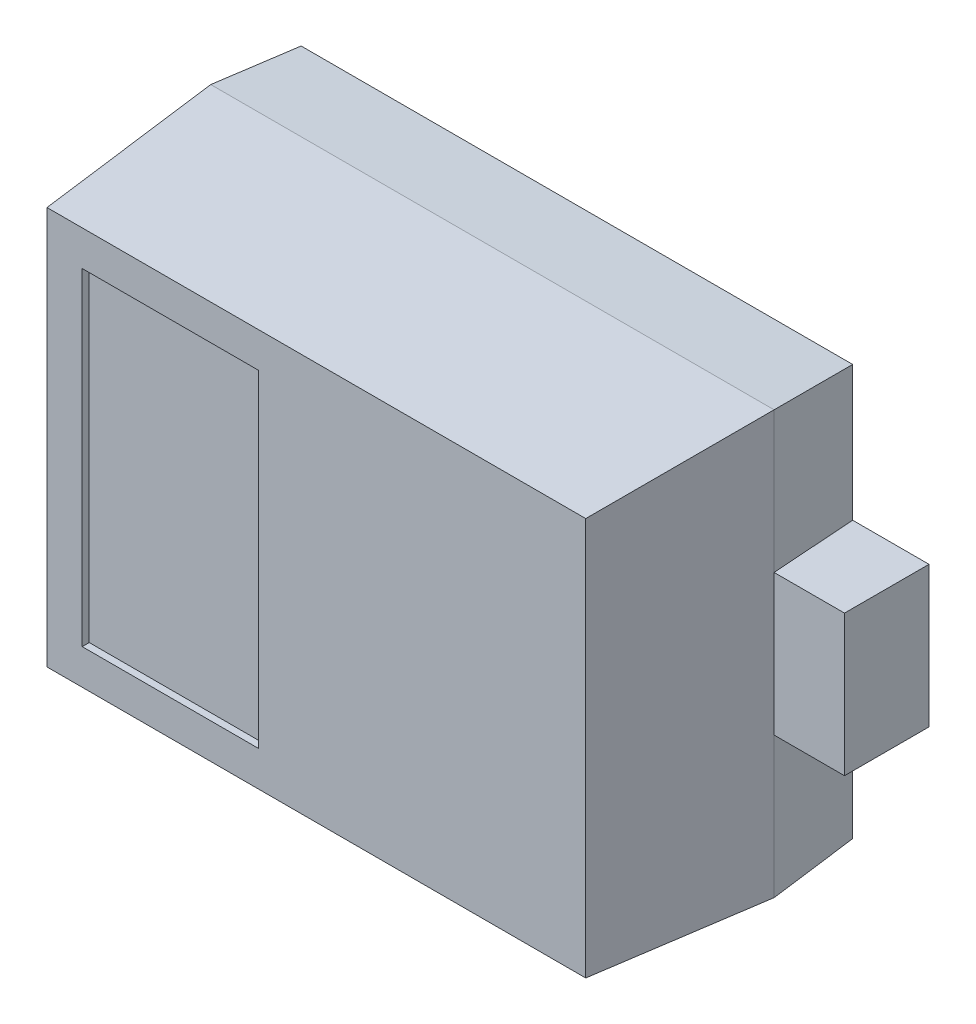
ISO-10303-21;
HEADER;
FILE_DESCRIPTION(('STEP AP214'),'2;1');
FILE_NAME('part.step','',(''),(''),'','','');
FILE_SCHEMA(('AUTOMOTIVE_DESIGN { 1 0 10303 214 1 1 1 1 }'));
ENDSEC;
DATA;
#1=APPLICATION_CONTEXT('core data for automotive mechanical design processes');
#2=APPLICATION_PROTOCOL_DEFINITION('international standard','automotive_design',2000,#1);
#3=PRODUCT_CONTEXT('',#1,'mechanical');
#4=PRODUCT('Part','Part','',(#3));
#5=PRODUCT_RELATED_PRODUCT_CATEGORY('part','',(#4));
#6=PRODUCT_DEFINITION_FORMATION('','',#4);
#7=PRODUCT_DEFINITION_CONTEXT('part definition',#1,'design');
#8=PRODUCT_DEFINITION('design','',#6,#7);
#9=PRODUCT_DEFINITION_SHAPE('','',#8);
#10=(LENGTH_UNIT() NAMED_UNIT(*) SI_UNIT(.MILLI.,.METRE.));
#11=(NAMED_UNIT(*) PLANE_ANGLE_UNIT() SI_UNIT($,.RADIAN.));
#12=(NAMED_UNIT(*) SI_UNIT($,.STERADIAN.) SOLID_ANGLE_UNIT());
#13=UNCERTAINTY_MEASURE_WITH_UNIT(LENGTH_MEASURE(1.E-05),#10,'distance_accuracy_value','');
#14=(GEOMETRIC_REPRESENTATION_CONTEXT(3) GLOBAL_UNCERTAINTY_ASSIGNED_CONTEXT((#13)) GLOBAL_UNIT_ASSIGNED_CONTEXT((#10,
#11,#12)) REPRESENTATION_CONTEXT('',''));
#15=CARTESIAN_POINT('',(0.,0.,0.));
#16=DIRECTION('',(0.,0.,1.));
#17=DIRECTION('',(1.,0.,0.));
#18=AXIS2_PLACEMENT_3D('',#15,#16,#17);
#19=CARTESIAN_POINT('',(-0.332518297014,-0.232518297014,0.36));
#20=DIRECTION('',(0.,0.,1.));
#21=DIRECTION('',(1.,0.,0.));
#22=AXIS2_PLACEMENT_3D('',#19,#20,#21);
#23=PLANE('',#22);
#24=DIRECTION('',(0.,1.,0.));
#25=VECTOR('',#24,1.);
#26=CARTESIAN_POINT('',(-0.08251829701412,-0.232518297014,0.36));
#27=LINE('',#26,#25);
#28=CARTESIAN_POINT('',(-0.08251829701412,-0.232518297014,0.36));
#29=VERTEX_POINT('',#28);
#30=CARTESIAN_POINT('',(-0.08251829701412,0.232518297014,0.36));
#31=VERTEX_POINT('',#30);
#32=EDGE_CURVE('E226',#29,#31,#27,.T.);
#33=ORIENTED_EDGE('',*,*,#32,.T.);
#34=DIRECTION('',(1.,0.,0.));
#35=VECTOR('',#34,1.);
#36=CARTESIAN_POINT('',(-0.332518297014,0.232518297014,0.36));
#37=LINE('',#36,#35);
#38=CARTESIAN_POINT('',(-0.332518297014,0.232518297014,0.36));
#39=VERTEX_POINT('',#38);
#40=EDGE_CURVE('E243',#31,#39,#37,.F.);
#41=ORIENTED_EDGE('',*,*,#40,.T.);
#42=DIRECTION('',(0.,1.,0.));
#43=VECTOR('',#42,1.);
#44=CARTESIAN_POINT('',(-0.332518297014,-0.232518297014,0.36));
#45=LINE('',#44,#43);
#46=CARTESIAN_POINT('',(-0.332518297014,-0.232518297014,0.36));
#47=VERTEX_POINT('',#46);
#48=EDGE_CURVE('E240',#47,#39,#45,.T.);
#49=ORIENTED_EDGE('',*,*,#48,.F.);
#50=DIRECTION('',(1.,0.,0.));
#51=VECTOR('',#50,1.);
#52=CARTESIAN_POINT('',(-0.332518297014,-0.232518297014,0.36));
#53=LINE('',#52,#51);
#54=EDGE_CURVE('E234',#29,#47,#53,.F.);
#55=ORIENTED_EDGE('',*,*,#54,.F.);
#56=EDGE_LOOP('',(#33,#41,#49,#55));
#57=FACE_BOUND('',#56,.T.);
#58=ADVANCED_FACE('F17',(#57),#23,.T.);
#59=CARTESIAN_POINT('',(-0.332518297014,0.232518297014,0.36));
#60=DIRECTION('',(0.,1.,0.));
#61=DIRECTION('',(0.,0.,1.));
#62=AXIS2_PLACEMENT_3D('',#59,#60,#61);
#63=PLANE('',#62);
#64=DIRECTION('',(0.,0.,-1.));
#65=VECTOR('',#64,1.);
#66=CARTESIAN_POINT('',(-0.332518297014,0.232518297014,0.36));
#67=LINE('',#66,#65);
#68=CARTESIAN_POINT('',(-0.332518297014,0.232518297014,0.37));
#69=VERTEX_POINT('',#68);
#70=EDGE_CURVE('E237',#39,#69,#67,.F.);
#71=ORIENTED_EDGE('',*,*,#70,.F.);
#72=ORIENTED_EDGE('',*,*,#40,.F.);
#73=DIRECTION('',(0.,0.,-1.));
#74=VECTOR('',#73,1.);
#75=CARTESIAN_POINT('',(-0.08251829701412,0.232518297014,0.36));
#76=LINE('',#75,#74);
#77=CARTESIAN_POINT('',(-0.08251829701412,0.232518297014,0.37));
#78=VERTEX_POINT('',#77);
#79=EDGE_CURVE('E204',#31,#78,#76,.F.);
#80=ORIENTED_EDGE('',*,*,#79,.T.);
#81=DIRECTION('',(-1.,0.,0.));
#82=VECTOR('',#81,1.);
#83=CARTESIAN_POINT('',(-0.382518297014,0.232518297014,0.37));
#84=LINE('',#83,#82);
#85=EDGE_CURVE('E202',#78,#69,#84,.T.);
#86=ORIENTED_EDGE('',*,*,#85,.T.);
#87=EDGE_LOOP('',(#71,#72,#80,#86));
#88=FACE_BOUND('',#87,.T.);
#89=ADVANCED_FACE('F424',(#88),#63,.F.);
#90=CARTESIAN_POINT('',(-0.332518297014,-0.232518297014,0.36));
#91=DIRECTION('',(1.,0.,0.));
#92=DIRECTION('',(0.,0.,-1.));
#93=AXIS2_PLACEMENT_3D('',#90,#91,#92);
#94=PLANE('',#93);
#95=ORIENTED_EDGE('',*,*,#70,.T.);
#96=DIRECTION('',(0.,1.,0.));
#97=VECTOR('',#96,1.);
#98=CARTESIAN_POINT('',(-0.332518297014,-0.282518297014,0.37));
#99=LINE('',#98,#97);
#100=CARTESIAN_POINT('',(-0.332518297014,-0.232518297014,0.37));
#101=VERTEX_POINT('',#100);
#102=EDGE_CURVE('E200',#69,#101,#99,.F.);
#103=ORIENTED_EDGE('',*,*,#102,.T.);
#104=DIRECTION('',(0.,0.,1.));
#105=VECTOR('',#104,1.);
#106=CARTESIAN_POINT('',(-0.332518297014,-0.232518297014,0.36));
#107=LINE('',#106,#105);
#108=EDGE_CURVE('E231',#47,#101,#107,.T.);
#109=ORIENTED_EDGE('',*,*,#108,.F.);
#110=ORIENTED_EDGE('',*,*,#48,.T.);
#111=EDGE_LOOP('',(#95,#103,#109,#110));
#112=FACE_BOUND('',#111,.T.);
#113=ADVANCED_FACE('F420',(#112),#94,.T.);
#114=CARTESIAN_POINT('',(-0.332518297014,-0.232518297014,0.36));
#115=DIRECTION('',(0.,1.,0.));
#116=DIRECTION('',(0.,0.,1.));
#117=AXIS2_PLACEMENT_3D('',#114,#115,#116);
#118=PLANE('',#117);
#119=ORIENTED_EDGE('',*,*,#108,.T.);
#120=DIRECTION('',(-1.,0.,0.));
#121=VECTOR('',#120,1.);
#122=CARTESIAN_POINT('',(-0.382518297014,-0.232518297014,0.37));
#123=LINE('',#122,#121);
#124=CARTESIAN_POINT('',(-0.08251829701412,-0.232518297014,0.37));
#125=VERTEX_POINT('',#124);
#126=EDGE_CURVE('E198',#101,#125,#123,.F.);
#127=ORIENTED_EDGE('',*,*,#126,.T.);
#128=DIRECTION('',(0.,0.,-1.));
#129=VECTOR('',#128,1.);
#130=CARTESIAN_POINT('',(-0.08251829701412,-0.232518297014,0.36));
#131=LINE('',#130,#129);
#132=EDGE_CURVE('E228',#125,#29,#131,.T.);
#133=ORIENTED_EDGE('',*,*,#132,.T.);
#134=ORIENTED_EDGE('',*,*,#54,.T.);
#135=EDGE_LOOP('',(#119,#127,#133,#134));
#136=FACE_BOUND('',#135,.T.);
#137=ADVANCED_FACE('F416',(#136),#118,.T.);
#138=CARTESIAN_POINT('',(-0.08251829701412,-0.232518297014,0.36));
#139=DIRECTION('',(1.,0.,0.));
#140=DIRECTION('',(0.,0.,-1.));
#141=AXIS2_PLACEMENT_3D('',#138,#139,#140);
#142=PLANE('',#141);
#143=ORIENTED_EDGE('',*,*,#79,.F.);
#144=ORIENTED_EDGE('',*,*,#32,.F.);
#145=ORIENTED_EDGE('',*,*,#132,.F.);
#146=DIRECTION('',(0.,1.,0.));
#147=VECTOR('',#146,1.);
#148=CARTESIAN_POINT('',(-0.08251829701412,-0.282518297014,0.37));
#149=LINE('',#148,#147);
#150=EDGE_CURVE('E195',#125,#78,#149,.T.);
#151=ORIENTED_EDGE('',*,*,#150,.T.);
#152=EDGE_LOOP('',(#143,#144,#145,#151));
#153=FACE_BOUND('',#152,.T.);
#154=ADVANCED_FACE('F413',(#153),#142,.F.);
#155=CARTESIAN_POINT('',(-0.391608782567,0.1,0.12));
#156=DIRECTION('',(0.,0.,1.));
#157=DIRECTION('',(1.,0.,0.));
#158=AXIS2_PLACEMENT_3D('',#155,#156,#157);
#159=PLANE('',#158);
#160=DIRECTION('',(0.,-1.,0.));
#161=VECTOR('',#160,1.);
#162=CARTESIAN_POINT('',(-0.5,0.1,0.12));
#163=LINE('',#162,#161);
#164=CARTESIAN_POINT('',(-0.5,-0.1,0.12));
#165=VERTEX_POINT('',#164);
#166=CARTESIAN_POINT('',(-0.5,0.1,0.12));
#167=VERTEX_POINT('',#166);
#168=EDGE_CURVE('E147',#165,#167,#163,.F.);
#169=ORIENTED_EDGE('',*,*,#168,.F.);
#170=DIRECTION('',(1.,0.,0.));
#171=VECTOR('',#170,1.);
#172=CARTESIAN_POINT('',(-0.391608782567,-0.1,0.12));
#173=LINE('',#172,#171);
#174=CARTESIAN_POINT('',(-0.4,-0.0999999999999878,0.12));
#175=VERTEX_POINT('',#174);
#176=EDGE_CURVE('E140',#175,#165,#173,.F.);
#177=ORIENTED_EDGE('',*,*,#176,.F.);
#178=DIRECTION('',(0.,-1.,0.));
#179=VECTOR('',#178,1.);
#180=CARTESIAN_POINT('',(-0.4,0.,0.12));
#181=LINE('',#180,#179);
#182=CARTESIAN_POINT('',(-0.4,0.0999999999999936,0.12));
#183=VERTEX_POINT('',#182);
#184=EDGE_CURVE('E144',#183,#175,#181,.T.);
#185=ORIENTED_EDGE('',*,*,#184,.F.);
#186=DIRECTION('',(1.,0.,0.));
#187=VECTOR('',#186,1.);
#188=CARTESIAN_POINT('',(-0.391608782567,0.1,0.12));
#189=LINE('',#188,#187);
#190=EDGE_CURVE('E222',#183,#167,#189,.F.);
#191=ORIENTED_EDGE('',*,*,#190,.T.);
#192=EDGE_LOOP('',(#169,#177,#185,#191));
#193=FACE_BOUND('',#192,.T.);
#194=ADVANCED_FACE('F142',(#193),#159,.T.);
#195=CARTESIAN_POINT('',(0.391608782567,-0.1,0.12));
#196=DIRECTION('',(0.,0.,1.));
#197=DIRECTION('',(1.,0.,0.));
#198=AXIS2_PLACEMENT_3D('',#195,#196,#197);
#199=PLANE('',#198);
#200=DIRECTION('',(0.,1.,0.));
#201=VECTOR('',#200,1.);
#202=CARTESIAN_POINT('',(0.5,-0.1,0.12));
#203=LINE('',#202,#201);
#204=CARTESIAN_POINT('',(0.5,0.1,0.12));
#205=VERTEX_POINT('',#204);
#206=CARTESIAN_POINT('',(0.5,-0.1,0.12));
#207=VERTEX_POINT('',#206);
#208=EDGE_CURVE('E205',#205,#207,#203,.F.);
#209=ORIENTED_EDGE('',*,*,#208,.F.);
#210=DIRECTION('',(-1.,0.,0.));
#211=VECTOR('',#210,1.);
#212=CARTESIAN_POINT('',(0.391608782567,0.1,0.12));
#213=LINE('',#212,#211);
#214=CARTESIAN_POINT('',(0.4,0.0999999999999878,0.12));
#215=VERTEX_POINT('',#214);
#216=EDGE_CURVE('E208',#215,#205,#213,.F.);
#217=ORIENTED_EDGE('',*,*,#216,.F.);
#218=DIRECTION('',(0.,1.,0.));
#219=VECTOR('',#218,1.);
#220=CARTESIAN_POINT('',(0.4,0.,0.12));
#221=LINE('',#220,#219);
#222=CARTESIAN_POINT('',(0.4,-0.0999999999999936,0.12));
#223=VERTEX_POINT('',#222);
#224=EDGE_CURVE('E303',#223,#215,#221,.T.);
#225=ORIENTED_EDGE('',*,*,#224,.F.);
#226=DIRECTION('',(-1.,0.,0.));
#227=VECTOR('',#226,1.);
#228=CARTESIAN_POINT('',(0.391608782567,-0.1,0.12));
#229=LINE('',#228,#227);
#230=EDGE_CURVE('E215',#223,#207,#229,.F.);
#231=ORIENTED_EDGE('',*,*,#230,.T.);
#232=EDGE_LOOP('',(#209,#217,#225,#231));
#233=FACE_BOUND('',#232,.T.);
#234=ADVANCED_FACE('F366',(#233),#199,.T.);
#235=CARTESIAN_POINT('',(-0.382518297014,-0.282518297014,0.37));
#236=DIRECTION('',(0.,0.,-1.));
#237=DIRECTION('',(-1.,0.,0.));
#238=AXIS2_PLACEMENT_3D('',#235,#236,#237);
#239=PLANE('',#238);
#240=ORIENTED_EDGE('',*,*,#126,.F.);
#241=ORIENTED_EDGE('',*,*,#102,.F.);
#242=ORIENTED_EDGE('',*,*,#85,.F.);
#243=ORIENTED_EDGE('',*,*,#150,.F.);
#244=EDGE_LOOP('',(#240,#241,#242,#243));
#245=FACE_BOUND('',#244,.T.);
#246=DIRECTION('',(1.,0.,0.));
#247=VECTOR('',#246,1.);
#248=CARTESIAN_POINT('',(0.,0.282518297014,0.37));
#249=LINE('',#248,#247);
#250=CARTESIAN_POINT('',(-0.382518297014,0.282518297014,0.37));
#251=VERTEX_POINT('',#250);
#252=CARTESIAN_POINT('',(0.382518297014,0.282518297014,0.37));
#253=VERTEX_POINT('',#252);
#254=EDGE_CURVE('E209',#251,#253,#249,.T.);
#255=ORIENTED_EDGE('',*,*,#254,.F.);
#256=DIRECTION('',(0.,1.,0.));
#257=VECTOR('',#256,1.);
#258=CARTESIAN_POINT('',(-0.382518297014,0.,0.37));
#259=LINE('',#258,#257);
#260=CARTESIAN_POINT('',(-0.382518297014,-0.282518297014,0.37));
#261=VERTEX_POINT('',#260);
#262=EDGE_CURVE('E171',#261,#251,#259,.T.);
#263=ORIENTED_EDGE('',*,*,#262,.F.);
#264=DIRECTION('',(-1.,0.,0.));
#265=VECTOR('',#264,1.);
#266=CARTESIAN_POINT('',(0.,-0.282518297014,0.37));
#267=LINE('',#266,#265);
#268=CARTESIAN_POINT('',(0.382518297014,-0.282518297014,0.37));
#269=VERTEX_POINT('',#268);
#270=EDGE_CURVE('E292',#269,#261,#267,.T.);
#271=ORIENTED_EDGE('',*,*,#270,.F.);
#272=DIRECTION('',(0.,-1.,0.));
#273=VECTOR('',#272,1.);
#274=CARTESIAN_POINT('',(0.382518297014,0.,0.37));
#275=LINE('',#274,#273);
#276=EDGE_CURVE('E298',#253,#269,#275,.T.);
#277=ORIENTED_EDGE('',*,*,#276,.F.);
#278=EDGE_LOOP('',(#255,#263,#271,#277));
#279=FACE_BOUND('',#278,.T.);
#280=ADVANCED_FACE('F343',(#245,#279),#239,.F.);
#281=CARTESIAN_POINT('',(-0.5,0.1,0.));
#282=DIRECTION('',(-1.,0.,0.));
#283=DIRECTION('',(0.,-1.,0.));
#284=AXIS2_PLACEMENT_3D('',#281,#282,#283);
#285=PLANE('',#284);
#286=DIRECTION('',(0.,0.,1.));
#287=VECTOR('',#286,1.);
#288=CARTESIAN_POINT('',(-0.5,-0.1,0.));
#289=LINE('',#288,#287);
#290=CARTESIAN_POINT('',(-0.5,-0.1,0.));
#291=VERTEX_POINT('',#290);
#292=EDGE_CURVE('E151',#165,#291,#289,.F.);
#293=ORIENTED_EDGE('',*,*,#292,.F.);
#294=ORIENTED_EDGE('',*,*,#168,.T.);
#295=DIRECTION('',(0.,0.,1.));
#296=VECTOR('',#295,1.);
#297=CARTESIAN_POINT('',(-0.5,0.1,0.));
#298=LINE('',#297,#296);
#299=CARTESIAN_POINT('',(-0.5,0.1,0.));
#300=VERTEX_POINT('',#299);
#301=EDGE_CURVE('E172',#167,#300,#298,.F.);
#302=ORIENTED_EDGE('',*,*,#301,.T.);
#303=DIRECTION('',(0.,1.,0.));
#304=VECTOR('',#303,1.);
#305=CARTESIAN_POINT('',(-0.5,0.1,0.));
#306=LINE('',#305,#304);
#307=EDGE_CURVE('E182',#300,#291,#306,.F.);
#308=ORIENTED_EDGE('',*,*,#307,.T.);
#309=EDGE_LOOP('',(#293,#294,#302,#308));
#310=FACE_BOUND('',#309,.T.);
#311=ADVANCED_FACE('F271',(#310),#285,.T.);
#312=CARTESIAN_POINT('',(-0.391608782567,-0.1,0.));
#313=DIRECTION('',(0.,-1.,0.));
#314=DIRECTION('',(1.,0.,0.));
#315=AXIS2_PLACEMENT_3D('',#312,#313,#314);
#316=PLANE('',#315);
#317=ORIENTED_EDGE('',*,*,#176,.T.);
#318=ORIENTED_EDGE('',*,*,#292,.T.);
#319=DIRECTION('',(1.,0.,0.));
#320=VECTOR('',#319,1.);
#321=CARTESIAN_POINT('',(-0.391608782567,-0.1,0.));
#322=LINE('',#321,#320);
#323=CARTESIAN_POINT('',(-0.391608782567,-0.0999999999999997,0.));
#324=VERTEX_POINT('',#323);
#325=EDGE_CURVE('E157',#291,#324,#322,.T.);
#326=ORIENTED_EDGE('',*,*,#325,.T.);
#327=DIRECTION('',(-0.069756473742295,0.,0.997564050259952));
#328=VECTOR('',#327,1.);
#329=CARTESIAN_POINT('',(-0.391608782567,-0.1,0.));
#330=LINE('',#329,#328);
#331=EDGE_CURVE('E21',#175,#324,#330,.F.);
#332=ORIENTED_EDGE('',*,*,#331,.F.);
#333=EDGE_LOOP('',(#317,#318,#326,#332));
#334=FACE_BOUND('',#333,.T.);
#335=ADVANCED_FACE('F155',(#334),#316,.T.);
#336=CARTESIAN_POINT('',(-0.391608782567,0.1,0.));
#337=DIRECTION('',(0.,-1.,0.));
#338=DIRECTION('',(1.,0.,0.));
#339=AXIS2_PLACEMENT_3D('',#336,#337,#338);
#340=PLANE('',#339);
#341=ORIENTED_EDGE('',*,*,#190,.F.);
#342=DIRECTION('',(-0.069756473742295,0.,0.997564050259952));
#343=VECTOR('',#342,1.);
#344=CARTESIAN_POINT('',(-0.391608782567,0.1,0.));
#345=LINE('',#344,#343);
#346=CARTESIAN_POINT('',(-0.391608782567,0.0999999999999998,0.));
#347=VERTEX_POINT('',#346);
#348=EDGE_CURVE('E189',#347,#183,#345,.T.);
#349=ORIENTED_EDGE('',*,*,#348,.F.);
#350=DIRECTION('',(1.,0.,0.));
#351=VECTOR('',#350,1.);
#352=CARTESIAN_POINT('',(-0.391608782567,0.1,0.));
#353=LINE('',#352,#351);
#354=EDGE_CURVE('E179',#347,#300,#353,.F.);
#355=ORIENTED_EDGE('',*,*,#354,.T.);
#356=ORIENTED_EDGE('',*,*,#301,.F.);
#357=EDGE_LOOP('',(#341,#349,#355,#356));
#358=FACE_BOUND('',#357,.T.);
#359=ADVANCED_FACE('F398',(#358),#340,.F.);
#360=CARTESIAN_POINT('',(-0.4,0.3,0.12));
#361=DIRECTION('',(-0.99756405025979,0.,0.0697564737446115));
#362=DIRECTION('',(0.,-1.,0.));
#363=AXIS2_PLACEMENT_3D('',#360,#361,#362);
#364=PLANE('',#363);
#365=ORIENTED_EDGE('',*,*,#262,.T.);
#366=DIRECTION('',(0.0695873743171474,-0.0695873743171471,0.995145815783441));
#367=VECTOR('',#366,1.);
#368=CARTESIAN_POINT('',(-0.391259148507,0.291259148507,0.245));
#369=LINE('',#368,#367);
#370=CARTESIAN_POINT('',(-0.4,0.3,0.12));
#371=VERTEX_POINT('',#370);
#372=EDGE_CURVE('E335',#371,#251,#369,.T.);
#373=ORIENTED_EDGE('',*,*,#372,.F.);
#374=DIRECTION('',(0.,1.,0.));
#375=VECTOR('',#374,1.);
#376=CARTESIAN_POINT('',(-0.4,0.,0.12));
#377=LINE('',#376,#375);
#378=EDGE_CURVE('E169',#183,#371,#377,.T.);
#379=ORIENTED_EDGE('',*,*,#378,.F.);
#380=ORIENTED_EDGE('',*,*,#184,.T.);
#381=DIRECTION('',(0.,1.,0.));
#382=VECTOR('',#381,1.);
#383=CARTESIAN_POINT('',(-0.4,0.,0.12));
#384=LINE('',#383,#382);
#385=CARTESIAN_POINT('',(-0.4,-0.3,0.12));
#386=VERTEX_POINT('',#385);
#387=EDGE_CURVE('E161',#386,#175,#384,.T.);
#388=ORIENTED_EDGE('',*,*,#387,.F.);
#389=DIRECTION('',(-0.0695873743171474,-0.0695873743171471,-0.995145815783441));
#390=VECTOR('',#389,1.);
#391=CARTESIAN_POINT('',(-0.391259148507,-0.291259148507,0.245));
#392=LINE('',#391,#390);
#393=EDGE_CURVE('E162',#261,#386,#392,.T.);
#394=ORIENTED_EDGE('',*,*,#393,.F.);
#395=EDGE_LOOP('',(#365,#373,#379,#380,#388,#394));
#396=FACE_BOUND('',#395,.T.);
#397=ADVANCED_FACE('F165',(#396),#364,.T.);
#398=CARTESIAN_POINT('',(0.4,0.3,0.12));
#399=DIRECTION('',(0.,0.99756405025979,0.0697564737446113));
#400=DIRECTION('',(-1.,0.,0.));
#401=AXIS2_PLACEMENT_3D('',#398,#399,#400);
#402=PLANE('',#401);
#403=ORIENTED_EDGE('',*,*,#254,.T.);
#404=DIRECTION('',(-0.0695873743171474,-0.0695873743171471,0.995145815783441));
#405=VECTOR('',#404,1.);
#406=CARTESIAN_POINT('',(0.391259148507,0.291259148507,0.245));
#407=LINE('',#406,#405);
#408=CARTESIAN_POINT('',(0.4,0.3,0.12));
#409=VERTEX_POINT('',#408);
#410=EDGE_CURVE('E300',#409,#253,#407,.T.);
#411=ORIENTED_EDGE('',*,*,#410,.F.);
#412=DIRECTION('',(1.,0.,0.));
#413=VECTOR('',#412,1.);
#414=CARTESIAN_POINT('',(0.,0.3,0.12));
#415=LINE('',#414,#413);
#416=EDGE_CURVE('E253',#371,#409,#415,.T.);
#417=ORIENTED_EDGE('',*,*,#416,.F.);
#418=ORIENTED_EDGE('',*,*,#372,.T.);
#419=EDGE_LOOP('',(#403,#411,#417,#418));
#420=FACE_BOUND('',#419,.T.);
#421=ADVANCED_FACE('F345',(#420),#402,.T.);
#422=CARTESIAN_POINT('',(0.5,-0.1,0.));
#423=DIRECTION('',(1.,0.,0.));
#424=DIRECTION('',(0.,1.,0.));
#425=AXIS2_PLACEMENT_3D('',#422,#423,#424);
#426=PLANE('',#425);
#427=DIRECTION('',(0.,0.,1.));
#428=VECTOR('',#427,1.);
#429=CARTESIAN_POINT('',(0.5,0.1,0.));
#430=LINE('',#429,#428);
#431=CARTESIAN_POINT('',(0.5,0.1,0.));
#432=VERTEX_POINT('',#431);
#433=EDGE_CURVE('E212',#205,#432,#430,.F.);
#434=ORIENTED_EDGE('',*,*,#433,.F.);
#435=ORIENTED_EDGE('',*,*,#208,.T.);
#436=DIRECTION('',(0.,0.,1.));
#437=VECTOR('',#436,1.);
#438=CARTESIAN_POINT('',(0.5,-0.1,0.));
#439=LINE('',#438,#437);
#440=CARTESIAN_POINT('',(0.5,-0.1,0.));
#441=VERTEX_POINT('',#440);
#442=EDGE_CURVE('E315',#207,#441,#439,.F.);
#443=ORIENTED_EDGE('',*,*,#442,.T.);
#444=DIRECTION('',(0.,1.,0.));
#445=VECTOR('',#444,1.);
#446=CARTESIAN_POINT('',(0.5,-0.1,0.));
#447=LINE('',#446,#445);
#448=EDGE_CURVE('E307',#441,#432,#447,.T.);
#449=ORIENTED_EDGE('',*,*,#448,.T.);
#450=EDGE_LOOP('',(#434,#435,#443,#449));
#451=FACE_BOUND('',#450,.T.);
#452=ADVANCED_FACE('F373',(#451),#426,.T.);
#453=CARTESIAN_POINT('',(0.391608782567,0.1,0.));
#454=DIRECTION('',(0.,1.,0.));
#455=DIRECTION('',(-1.,0.,0.));
#456=AXIS2_PLACEMENT_3D('',#453,#454,#455);
#457=PLANE('',#456);
#458=ORIENTED_EDGE('',*,*,#216,.T.);
#459=ORIENTED_EDGE('',*,*,#433,.T.);
#460=DIRECTION('',(1.,0.,0.));
#461=VECTOR('',#460,1.);
#462=CARTESIAN_POINT('',(0.391608782567,0.1,0.));
#463=LINE('',#462,#461);
#464=CARTESIAN_POINT('',(0.391608782567,0.0999999999999997,0.));
#465=VERTEX_POINT('',#464);
#466=EDGE_CURVE('E249',#432,#465,#463,.F.);
#467=ORIENTED_EDGE('',*,*,#466,.T.);
#468=DIRECTION('',(0.069756473742295,0.,0.997564050259952));
#469=VECTOR('',#468,1.);
#470=CARTESIAN_POINT('',(0.391608782567,0.1,0.));
#471=LINE('',#470,#469);
#472=EDGE_CURVE('E250',#215,#465,#471,.F.);
#473=ORIENTED_EDGE('',*,*,#472,.F.);
#474=EDGE_LOOP('',(#458,#459,#467,#473));
#475=FACE_BOUND('',#474,.T.);
#476=ADVANCED_FACE('F360',(#475),#457,.T.);
#477=CARTESIAN_POINT('',(0.391608782567,-0.1,0.));
#478=DIRECTION('',(0.,1.,0.));
#479=DIRECTION('',(-1.,0.,0.));
#480=AXIS2_PLACEMENT_3D('',#477,#478,#479);
#481=PLANE('',#480);
#482=ORIENTED_EDGE('',*,*,#230,.F.);
#483=DIRECTION('',(0.069756473742295,0.,0.997564050259952));
#484=VECTOR('',#483,1.);
#485=CARTESIAN_POINT('',(0.391608782567,-0.1,0.));
#486=LINE('',#485,#484);
#487=CARTESIAN_POINT('',(0.391608782567,-0.0999999999999998,0.));
#488=VERTEX_POINT('',#487);
#489=EDGE_CURVE('E245',#488,#223,#486,.T.);
#490=ORIENTED_EDGE('',*,*,#489,.F.);
#491=DIRECTION('',(1.,0.,0.));
#492=VECTOR('',#491,1.);
#493=CARTESIAN_POINT('',(0.391608782567,-0.1,0.));
#494=LINE('',#493,#492);
#495=EDGE_CURVE('E304',#488,#441,#494,.T.);
#496=ORIENTED_EDGE('',*,*,#495,.T.);
#497=ORIENTED_EDGE('',*,*,#442,.F.);
#498=EDGE_LOOP('',(#482,#490,#496,#497));
#499=FACE_BOUND('',#498,.T.);
#500=ADVANCED_FACE('F369',(#499),#481,.F.);
#501=CARTESIAN_POINT('',(0.4,-0.3,0.12));
#502=DIRECTION('',(0.99756405025979,0.,0.0697564737446115));
#503=DIRECTION('',(0.,1.,0.));
#504=AXIS2_PLACEMENT_3D('',#501,#502,#503);
#505=PLANE('',#504);
#506=ORIENTED_EDGE('',*,*,#276,.T.);
#507=DIRECTION('',(-0.0695873743171474,0.0695873743171471,0.995145815783441));
#508=VECTOR('',#507,1.);
#509=CARTESIAN_POINT('',(0.391259148507,-0.291259148507,0.245));
#510=LINE('',#509,#508);
#511=CARTESIAN_POINT('',(0.4,-0.3,0.12));
#512=VERTEX_POINT('',#511);
#513=EDGE_CURVE('E295',#512,#269,#510,.T.);
#514=ORIENTED_EDGE('',*,*,#513,.F.);
#515=DIRECTION('',(0.,-1.,0.));
#516=VECTOR('',#515,1.);
#517=CARTESIAN_POINT('',(0.4,0.,0.12));
#518=LINE('',#517,#516);
#519=EDGE_CURVE('E248',#223,#512,#518,.T.);
#520=ORIENTED_EDGE('',*,*,#519,.F.);
#521=ORIENTED_EDGE('',*,*,#224,.T.);
#522=DIRECTION('',(0.,-1.,0.));
#523=VECTOR('',#522,1.);
#524=CARTESIAN_POINT('',(0.4,0.,0.12));
#525=LINE('',#524,#523);
#526=EDGE_CURVE('E288',#409,#215,#525,.T.);
#527=ORIENTED_EDGE('',*,*,#526,.F.);
#528=ORIENTED_EDGE('',*,*,#410,.T.);
#529=EDGE_LOOP('',(#506,#514,#520,#521,#527,#528));
#530=FACE_BOUND('',#529,.T.);
#531=ADVANCED_FACE('F363',(#530),#505,.T.);
#532=CARTESIAN_POINT('',(-0.4,-0.3,0.12));
#533=DIRECTION('',(0.,-0.99756405025979,0.0697564737446113));
#534=DIRECTION('',(1.,0.,0.));
#535=AXIS2_PLACEMENT_3D('',#532,#533,#534);
#536=PLANE('',#535);
#537=ORIENTED_EDGE('',*,*,#270,.T.);
#538=ORIENTED_EDGE('',*,*,#393,.T.);
#539=DIRECTION('',(-1.,0.,0.));
#540=VECTOR('',#539,1.);
#541=CARTESIAN_POINT('',(0.,-0.3,0.12));
#542=LINE('',#541,#540);
#543=EDGE_CURVE('E279',#512,#386,#542,.T.);
#544=ORIENTED_EDGE('',*,*,#543,.F.);
#545=ORIENTED_EDGE('',*,*,#513,.T.);
#546=EDGE_LOOP('',(#537,#538,#544,#545));
#547=FACE_BOUND('',#546,.T.);
#548=ADVANCED_FACE('F376',(#547),#536,.T.);
#549=CARTESIAN_POINT('',(-0.391608782567,0.291608782567,0.));
#550=DIRECTION('',(-0.997564050259952,0.,-0.069756473742295));
#551=DIRECTION('',(0.,-1.,0.));
#552=AXIS2_PLACEMENT_3D('',#549,#550,#551);
#553=PLANE('',#552);
#554=DIRECTION('',(0.0695873743148476,0.0695873743148472,-0.995145815783763));
#555=VECTOR('',#554,1.);
#556=CARTESIAN_POINT('',(-0.3958043912835,-0.2958043912835,0.06));
#557=LINE('',#556,#555);
#558=CARTESIAN_POINT('',(-0.391608782567,-0.291608782567,0.));
#559=VERTEX_POINT('',#558);
#560=EDGE_CURVE('E177',#386,#559,#557,.T.);
#561=ORIENTED_EDGE('',*,*,#560,.F.);
#562=ORIENTED_EDGE('',*,*,#387,.T.);
#563=ORIENTED_EDGE('',*,*,#331,.T.);
#564=DIRECTION('',(0.,1.,0.));
#565=VECTOR('',#564,1.);
#566=CARTESIAN_POINT('',(-0.391608782567,-0.291608782567,0.));
#567=LINE('',#566,#565);
#568=EDGE_CURVE('E190',#559,#324,#567,.T.);
#569=ORIENTED_EDGE('',*,*,#568,.F.);
#570=EDGE_LOOP('',(#561,#562,#563,#569));
#571=FACE_BOUND('',#570,.T.);
#572=ADVANCED_FACE('F175',(#571),#553,.T.);
#573=CARTESIAN_POINT('',(-0.391608782567,0.291608782567,0.));
#574=DIRECTION('',(-0.997564050259952,0.,-0.069756473742295));
#575=DIRECTION('',(0.,-1.,0.));
#576=AXIS2_PLACEMENT_3D('',#573,#574,#575);
#577=PLANE('',#576);
#578=ORIENTED_EDGE('',*,*,#348,.T.);
#579=ORIENTED_EDGE('',*,*,#378,.T.);
#580=DIRECTION('',(-0.0695873743148476,0.0695873743148472,0.995145815783763));
#581=VECTOR('',#580,1.);
#582=CARTESIAN_POINT('',(-0.3958043912835,0.2958043912835,0.06));
#583=LINE('',#582,#581);
#584=CARTESIAN_POINT('',(-0.391608782567,0.291608782567,0.));
#585=VERTEX_POINT('',#584);
#586=EDGE_CURVE('E256',#585,#371,#583,.T.);
#587=ORIENTED_EDGE('',*,*,#586,.F.);
#588=DIRECTION('',(0.,1.,0.));
#589=VECTOR('',#588,1.);
#590=CARTESIAN_POINT('',(-0.391608782567,-0.291608782567,0.));
#591=LINE('',#590,#589);
#592=EDGE_CURVE('E191',#347,#585,#591,.T.);
#593=ORIENTED_EDGE('',*,*,#592,.F.);
#594=EDGE_LOOP('',(#578,#579,#587,#593));
#595=FACE_BOUND('',#594,.T.);
#596=ADVANCED_FACE('F352',(#595),#577,.T.);
#597=CARTESIAN_POINT('',(0.391608782567,0.291608782567,0.));
#598=DIRECTION('',(0.,0.997564050259952,-0.0697564737422945));
#599=DIRECTION('',(-1.,0.,0.));
#600=AXIS2_PLACEMENT_3D('',#597,#598,#599);
#601=PLANE('',#600);
#602=ORIENTED_EDGE('',*,*,#416,.T.);
#603=DIRECTION('',(0.0695873743148476,0.0695873743148472,0.995145815783763));
#604=VECTOR('',#603,1.);
#605=CARTESIAN_POINT('',(0.3958043912835,0.2958043912835,0.06));
#606=LINE('',#605,#604);
#607=CARTESIAN_POINT('',(0.391608782567,0.291608782567,0.));
#608=VERTEX_POINT('',#607);
#609=EDGE_CURVE('E252',#608,#409,#606,.T.);
#610=ORIENTED_EDGE('',*,*,#609,.F.);
#611=DIRECTION('',(-1.,0.,0.));
#612=VECTOR('',#611,1.);
#613=CARTESIAN_POINT('',(-0.391608782567,0.291608782567,0.));
#614=LINE('',#613,#612);
#615=EDGE_CURVE('E283',#585,#608,#614,.F.);
#616=ORIENTED_EDGE('',*,*,#615,.F.);
#617=ORIENTED_EDGE('',*,*,#586,.T.);
#618=EDGE_LOOP('',(#602,#610,#616,#617));
#619=FACE_BOUND('',#618,.T.);
#620=ADVANCED_FACE('F349',(#619),#601,.T.);
#621=CARTESIAN_POINT('',(0.391608782567,-0.291608782567,0.));
#622=DIRECTION('',(0.997564050259952,0.,-0.069756473742295));
#623=DIRECTION('',(0.,1.,0.));
#624=AXIS2_PLACEMENT_3D('',#621,#622,#623);
#625=PLANE('',#624);
#626=ORIENTED_EDGE('',*,*,#609,.T.);
#627=ORIENTED_EDGE('',*,*,#526,.T.);
#628=ORIENTED_EDGE('',*,*,#472,.T.);
#629=DIRECTION('',(0.,1.,0.));
#630=VECTOR('',#629,1.);
#631=CARTESIAN_POINT('',(0.391608782567,-0.291608782567,0.));
#632=LINE('',#631,#630);
#633=EDGE_CURVE('E311',#608,#465,#632,.F.);
#634=ORIENTED_EDGE('',*,*,#633,.F.);
#635=EDGE_LOOP('',(#626,#627,#628,#634));
#636=FACE_BOUND('',#635,.T.);
#637=ADVANCED_FACE('F357',(#636),#625,.T.);
#638=CARTESIAN_POINT('',(0.391608782567,-0.291608782567,0.));
#639=DIRECTION('',(0.997564050259952,0.,-0.069756473742295));
#640=DIRECTION('',(0.,1.,0.));
#641=AXIS2_PLACEMENT_3D('',#638,#639,#640);
#642=PLANE('',#641);
#643=ORIENTED_EDGE('',*,*,#489,.T.);
#644=ORIENTED_EDGE('',*,*,#519,.T.);
#645=DIRECTION('',(0.0695873743148476,-0.0695873743148472,0.995145815783763));
#646=VECTOR('',#645,1.);
#647=CARTESIAN_POINT('',(0.3958043912835,-0.2958043912835,0.06));
#648=LINE('',#647,#646);
#649=CARTESIAN_POINT('',(0.391608782567,-0.291608782567,0.));
#650=VERTEX_POINT('',#649);
#651=EDGE_CURVE('E36',#650,#512,#648,.T.);
#652=ORIENTED_EDGE('',*,*,#651,.F.);
#653=DIRECTION('',(0.,1.,0.));
#654=VECTOR('',#653,1.);
#655=CARTESIAN_POINT('',(0.391608782567,-0.291608782567,0.));
#656=LINE('',#655,#654);
#657=EDGE_CURVE('E27',#488,#650,#656,.F.);
#658=ORIENTED_EDGE('',*,*,#657,.F.);
#659=EDGE_LOOP('',(#643,#644,#652,#658));
#660=FACE_BOUND('',#659,.T.);
#661=ADVANCED_FACE('F374',(#660),#642,.T.);
#662=CARTESIAN_POINT('',(-0.391608782567,-0.291608782567,0.));
#663=DIRECTION('',(0.,-0.997564050259952,-0.0697564737422945));
#664=DIRECTION('',(1.,0.,0.));
#665=AXIS2_PLACEMENT_3D('',#662,#663,#664);
#666=PLANE('',#665);
#667=ORIENTED_EDGE('',*,*,#543,.T.);
#668=ORIENTED_EDGE('',*,*,#560,.T.);
#669=DIRECTION('',(-1.,0.,0.));
#670=VECTOR('',#669,1.);
#671=CARTESIAN_POINT('',(-0.391608782567,-0.291608782567,0.));
#672=LINE('',#671,#670);
#673=EDGE_CURVE('E11',#650,#559,#672,.T.);
#674=ORIENTED_EDGE('',*,*,#673,.F.);
#675=ORIENTED_EDGE('',*,*,#651,.T.);
#676=EDGE_LOOP('',(#667,#668,#674,#675));
#677=FACE_BOUND('',#676,.T.);
#678=ADVANCED_FACE('F19',(#677),#666,.T.);
#679=CARTESIAN_POINT('',(-0.391608782567,-0.291608782567,0.));
#680=DIRECTION('',(0.,0.,-1.));
#681=DIRECTION('',(-1.,0.,0.));
#682=AXIS2_PLACEMENT_3D('',#679,#680,#681);
#683=PLANE('',#682);
#684=ORIENTED_EDGE('',*,*,#657,.T.);
#685=ORIENTED_EDGE('',*,*,#673,.T.);
#686=ORIENTED_EDGE('',*,*,#568,.T.);
#687=ORIENTED_EDGE('',*,*,#325,.F.);
#688=ORIENTED_EDGE('',*,*,#307,.F.);
#689=ORIENTED_EDGE('',*,*,#354,.F.);
#690=ORIENTED_EDGE('',*,*,#592,.T.);
#691=ORIENTED_EDGE('',*,*,#615,.T.);
#692=ORIENTED_EDGE('',*,*,#633,.T.);
#693=ORIENTED_EDGE('',*,*,#466,.F.);
#694=ORIENTED_EDGE('',*,*,#448,.F.);
#695=ORIENTED_EDGE('',*,*,#495,.F.);
#696=EDGE_LOOP('',(#684,#685,#686,#687,#688,#689,#690,#691,#692,#693,#694,#695));
#697=FACE_BOUND('',#696,.T.);
#698=ADVANCED_FACE('F276',(#697),#683,.T.);
#699=CLOSED_SHELL('',(#58,#89,#113,#137,#154,#194,#234,#280,#311,#335,#359,#397,#421,#452,#476,
#500,#531,#548,#572,#596,#620,#637,#661,#678,#698));
#700=MANIFOLD_SOLID_BREP('B1',#699);
#701=ADVANCED_BREP_SHAPE_REPRESENTATION('',(#18,#700),#14);
#702=SHAPE_DEFINITION_REPRESENTATION(#9,#701);
ENDSEC;
END-ISO-10303-21;
